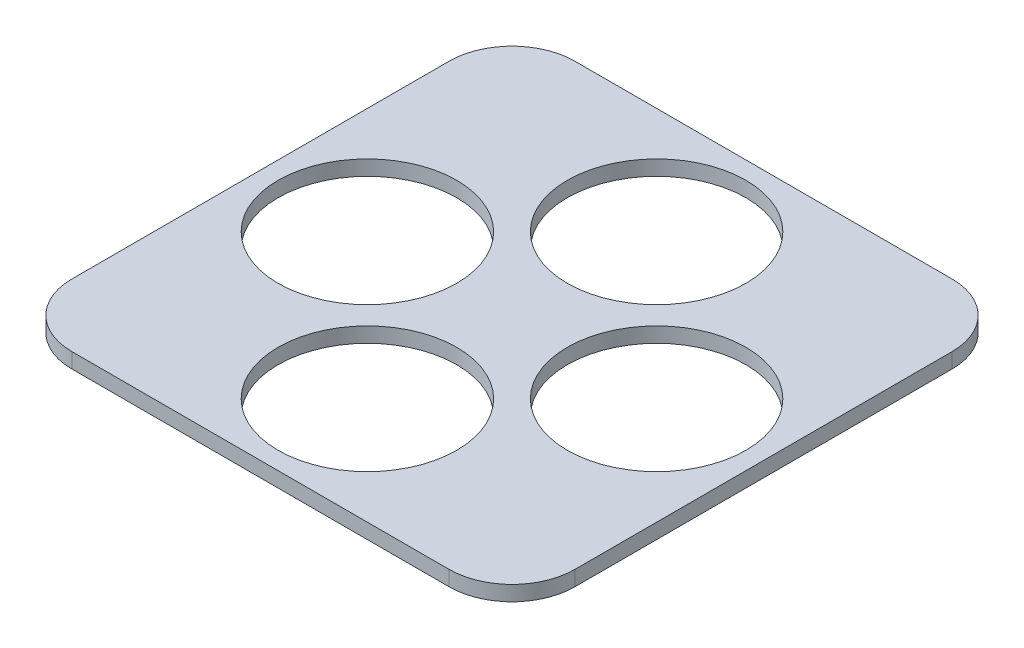
ISO-10303-21;
HEADER;
FILE_DESCRIPTION(('STEP AP214'),'2;1');
FILE_NAME('part.step','',(''),(''),'','','');
FILE_SCHEMA(('AUTOMOTIVE_DESIGN { 1 0 10303 214 1 1 1 1 }'));
ENDSEC;
DATA;
#1=APPLICATION_CONTEXT('core data for automotive mechanical design processes');
#2=APPLICATION_PROTOCOL_DEFINITION('international standard','automotive_design',2000,#1);
#3=PRODUCT_CONTEXT('',#1,'mechanical');
#4=PRODUCT('Part','Part','',(#3));
#5=PRODUCT_RELATED_PRODUCT_CATEGORY('part','',(#4));
#6=PRODUCT_DEFINITION_FORMATION('','',#4);
#7=PRODUCT_DEFINITION_CONTEXT('part definition',#1,'design');
#8=PRODUCT_DEFINITION('design','',#6,#7);
#9=PRODUCT_DEFINITION_SHAPE('','',#8);
#10=(LENGTH_UNIT() NAMED_UNIT(*) SI_UNIT(.MILLI.,.METRE.));
#11=(NAMED_UNIT(*) PLANE_ANGLE_UNIT() SI_UNIT($,.RADIAN.));
#12=(NAMED_UNIT(*) SI_UNIT($,.STERADIAN.) SOLID_ANGLE_UNIT());
#13=UNCERTAINTY_MEASURE_WITH_UNIT(LENGTH_MEASURE(1.E-05),#10,'distance_accuracy_value','');
#14=(GEOMETRIC_REPRESENTATION_CONTEXT(3) GLOBAL_UNCERTAINTY_ASSIGNED_CONTEXT((#13)) GLOBAL_UNIT_ASSIGNED_CONTEXT((#10,
#11,#12)) REPRESENTATION_CONTEXT('',''));
#15=CARTESIAN_POINT('',(0.,0.,0.));
#16=DIRECTION('',(0.,0.,1.));
#17=DIRECTION('',(1.,0.,0.));
#18=AXIS2_PLACEMENT_3D('',#15,#16,#17);
#19=CARTESIAN_POINT('',(15.,1.2,-15.));
#20=DIRECTION('',(0.,1.,0.));
#21=DIRECTION('',(0.,0.,1.));
#22=AXIS2_PLACEMENT_3D('',#19,#20,#21);
#23=PLANE('',#22);
#24=CARTESIAN_POINT('',(0.,1.2,11.5));
#25=DIRECTION('',(0.,1.,0.));
#26=DIRECTION('',(0.,0.,1.));
#27=AXIS2_PLACEMENT_3D('',#24,#25,#26);
#28=CIRCLE('',#27,7.1);
#29=CARTESIAN_POINT('',(0.,1.2,18.6));
#30=VERTEX_POINT('',#29);
#31=EDGE_CURVE('E187',#30,#30,#28,.T.);
#32=ORIENTED_EDGE('',*,*,#31,.F.);
#33=EDGE_LOOP('',(#32));
#34=FACE_BOUND('',#33,.T.);
#35=CARTESIAN_POINT('',(0.,1.2,-11.5));
#36=DIRECTION('',(0.,1.,0.));
#37=DIRECTION('',(0.,0.,1.));
#38=AXIS2_PLACEMENT_3D('',#35,#36,#37);
#39=CIRCLE('',#38,7.1);
#40=CARTESIAN_POINT('',(0.,1.2,-4.4));
#41=VERTEX_POINT('',#40);
#42=EDGE_CURVE('E133',#41,#41,#39,.T.);
#43=ORIENTED_EDGE('',*,*,#42,.F.);
#44=EDGE_LOOP('',(#43));
#45=FACE_BOUND('',#44,.T.);
#46=CARTESIAN_POINT('',(15.,1.2,-15.));
#47=DIRECTION('',(0.,1.,0.));
#48=DIRECTION('',(0.,0.,1.));
#49=AXIS2_PLACEMENT_3D('',#46,#47,#48);
#50=CIRCLE('',#49,5.);
#51=CARTESIAN_POINT('',(20.,1.2,-15.));
#52=VERTEX_POINT('',#51);
#53=CARTESIAN_POINT('',(15.,1.2,-20.));
#54=VERTEX_POINT('',#53);
#55=EDGE_CURVE('E144',#52,#54,#50,.T.);
#56=ORIENTED_EDGE('',*,*,#55,.T.);
#57=DIRECTION('',(-1.,0.,0.));
#58=VECTOR('',#57,1.);
#59=CARTESIAN_POINT('',(-15.,1.2,-20.));
#60=LINE('',#59,#58);
#61=CARTESIAN_POINT('',(-15.,1.2,-20.));
#62=VERTEX_POINT('',#61);
#63=EDGE_CURVE('E92',#54,#62,#60,.T.);
#64=ORIENTED_EDGE('',*,*,#63,.T.);
#65=CARTESIAN_POINT('',(-15.,1.2,-15.));
#66=DIRECTION('',(0.,1.,0.));
#67=DIRECTION('',(0.,0.,-1.));
#68=AXIS2_PLACEMENT_3D('',#65,#66,#67);
#69=CIRCLE('',#68,5.);
#70=CARTESIAN_POINT('',(-20.,1.2,-15.));
#71=VERTEX_POINT('',#70);
#72=EDGE_CURVE('E159',#62,#71,#69,.T.);
#73=ORIENTED_EDGE('',*,*,#72,.T.);
#74=DIRECTION('',(0.,0.,1.));
#75=VECTOR('',#74,1.);
#76=CARTESIAN_POINT('',(-20.,1.2,15.));
#77=LINE('',#76,#75);
#78=CARTESIAN_POINT('',(-20.,1.2,15.));
#79=VERTEX_POINT('',#78);
#80=EDGE_CURVE('E172',#71,#79,#77,.T.);
#81=ORIENTED_EDGE('',*,*,#80,.T.);
#82=CARTESIAN_POINT('',(-15.,1.2,15.));
#83=DIRECTION('',(0.,1.,0.));
#84=DIRECTION('',(0.,0.,-1.));
#85=AXIS2_PLACEMENT_3D('',#82,#83,#84);
#86=CIRCLE('',#85,5.);
#87=CARTESIAN_POINT('',(-15.,1.2,20.));
#88=VERTEX_POINT('',#87);
#89=EDGE_CURVE('E111',#79,#88,#86,.T.);
#90=ORIENTED_EDGE('',*,*,#89,.T.);
#91=DIRECTION('',(1.,0.,0.));
#92=VECTOR('',#91,1.);
#93=CARTESIAN_POINT('',(-15.,1.2,20.));
#94=LINE('',#93,#92);
#95=CARTESIAN_POINT('',(15.,1.2,20.));
#96=VERTEX_POINT('',#95);
#97=EDGE_CURVE('E105',#88,#96,#94,.T.);
#98=ORIENTED_EDGE('',*,*,#97,.T.);
#99=CARTESIAN_POINT('',(15.,1.2,15.));
#100=DIRECTION('',(0.,1.,0.));
#101=DIRECTION('',(0.,0.,-1.));
#102=AXIS2_PLACEMENT_3D('',#99,#100,#101);
#103=CIRCLE('',#102,5.);
#104=CARTESIAN_POINT('',(20.,1.2,15.));
#105=VERTEX_POINT('',#104);
#106=EDGE_CURVE('E109',#96,#105,#103,.T.);
#107=ORIENTED_EDGE('',*,*,#106,.T.);
#108=DIRECTION('',(0.,0.,-1.));
#109=VECTOR('',#108,1.);
#110=CARTESIAN_POINT('',(20.,1.2,15.));
#111=LINE('',#110,#109);
#112=EDGE_CURVE('E49',#105,#52,#111,.T.);
#113=ORIENTED_EDGE('',*,*,#112,.T.);
#114=EDGE_LOOP('',(#56,#64,#73,#81,#90,#98,#107,#113));
#115=FACE_BOUND('',#114,.T.);
#116=CARTESIAN_POINT('',(11.5,1.2,0.));
#117=DIRECTION('',(0.,1.,0.));
#118=DIRECTION('',(0.,0.,1.));
#119=AXIS2_PLACEMENT_3D('',#116,#117,#118);
#120=CIRCLE('',#119,7.1);
#121=CARTESIAN_POINT('',(11.5,1.2,7.1));
#122=VERTEX_POINT('',#121);
#123=EDGE_CURVE('E181',#122,#122,#120,.T.);
#124=ORIENTED_EDGE('',*,*,#123,.F.);
#125=EDGE_LOOP('',(#124));
#126=FACE_BOUND('',#125,.T.);
#127=CARTESIAN_POINT('',(-11.5,1.2,0.));
#128=DIRECTION('',(0.,1.,0.));
#129=DIRECTION('',(0.,0.,1.));
#130=AXIS2_PLACEMENT_3D('',#127,#128,#129);
#131=CIRCLE('',#130,7.1);
#132=CARTESIAN_POINT('',(-11.5,1.2,7.1));
#133=VERTEX_POINT('',#132);
#134=EDGE_CURVE('E193',#133,#133,#131,.T.);
#135=ORIENTED_EDGE('',*,*,#134,.F.);
#136=EDGE_LOOP('',(#135));
#137=FACE_BOUND('',#136,.T.);
#138=ADVANCED_FACE('F32',(#34,#45,#115,#126,#137),#23,.T.);
#139=CARTESIAN_POINT('',(15.,0.,-15.));
#140=DIRECTION('',(0.,1.,0.));
#141=DIRECTION('',(0.,0.,1.));
#142=AXIS2_PLACEMENT_3D('',#139,#140,#141);
#143=PLANE('',#142);
#144=CARTESIAN_POINT('',(15.,0.,-15.));
#145=DIRECTION('',(0.,1.,0.));
#146=DIRECTION('',(0.,0.,1.));
#147=AXIS2_PLACEMENT_3D('',#144,#145,#146);
#148=CIRCLE('',#147,5.);
#149=CARTESIAN_POINT('',(20.,0.,-15.));
#150=VERTEX_POINT('',#149);
#151=CARTESIAN_POINT('',(15.,0.,-20.));
#152=VERTEX_POINT('',#151);
#153=EDGE_CURVE('E129',#150,#152,#148,.T.);
#154=ORIENTED_EDGE('',*,*,#153,.F.);
#155=DIRECTION('',(0.,0.,-1.));
#156=VECTOR('',#155,1.);
#157=CARTESIAN_POINT('',(20.,0.,15.));
#158=LINE('',#157,#156);
#159=CARTESIAN_POINT('',(20.,0.,15.));
#160=VERTEX_POINT('',#159);
#161=EDGE_CURVE('E84',#160,#150,#158,.T.);
#162=ORIENTED_EDGE('',*,*,#161,.F.);
#163=CARTESIAN_POINT('',(15.,0.,15.));
#164=DIRECTION('',(0.,1.,0.));
#165=DIRECTION('',(0.,0.,-1.));
#166=AXIS2_PLACEMENT_3D('',#163,#164,#165);
#167=CIRCLE('',#166,5.);
#168=CARTESIAN_POINT('',(15.,0.,20.));
#169=VERTEX_POINT('',#168);
#170=EDGE_CURVE('E78',#169,#160,#167,.T.);
#171=ORIENTED_EDGE('',*,*,#170,.F.);
#172=DIRECTION('',(1.,0.,0.));
#173=VECTOR('',#172,1.);
#174=CARTESIAN_POINT('',(-15.,0.,20.));
#175=LINE('',#174,#173);
#176=CARTESIAN_POINT('',(-15.,0.,20.));
#177=VERTEX_POINT('',#176);
#178=EDGE_CURVE('E119',#177,#169,#175,.T.);
#179=ORIENTED_EDGE('',*,*,#178,.F.);
#180=CARTESIAN_POINT('',(-15.,0.,15.));
#181=DIRECTION('',(0.,1.,0.));
#182=DIRECTION('',(0.,0.,-1.));
#183=AXIS2_PLACEMENT_3D('',#180,#181,#182);
#184=CIRCLE('',#183,5.);
#185=CARTESIAN_POINT('',(-20.,0.,15.));
#186=VERTEX_POINT('',#185);
#187=EDGE_CURVE('E139',#186,#177,#184,.T.);
#188=ORIENTED_EDGE('',*,*,#187,.F.);
#189=DIRECTION('',(0.,0.,1.));
#190=VECTOR('',#189,1.);
#191=CARTESIAN_POINT('',(-20.,0.,15.));
#192=LINE('',#191,#190);
#193=CARTESIAN_POINT('',(-20.,0.,-15.));
#194=VERTEX_POINT('',#193);
#195=EDGE_CURVE('E137',#194,#186,#192,.T.);
#196=ORIENTED_EDGE('',*,*,#195,.F.);
#197=CARTESIAN_POINT('',(-15.,0.,-15.));
#198=DIRECTION('',(0.,1.,0.));
#199=DIRECTION('',(0.,0.,-1.));
#200=AXIS2_PLACEMENT_3D('',#197,#198,#199);
#201=CIRCLE('',#200,5.);
#202=CARTESIAN_POINT('',(-15.,0.,-20.));
#203=VERTEX_POINT('',#202);
#204=EDGE_CURVE('E135',#203,#194,#201,.T.);
#205=ORIENTED_EDGE('',*,*,#204,.F.);
#206=DIRECTION('',(-1.,0.,0.));
#207=VECTOR('',#206,1.);
#208=CARTESIAN_POINT('',(-15.,0.,-20.));
#209=LINE('',#208,#207);
#210=EDGE_CURVE('E132',#152,#203,#209,.T.);
#211=ORIENTED_EDGE('',*,*,#210,.F.);
#212=EDGE_LOOP('',(#154,#162,#171,#179,#188,#196,#205,#211));
#213=FACE_BOUND('',#212,.T.);
#214=CARTESIAN_POINT('',(0.,0.,-11.5));
#215=DIRECTION('',(0.,1.,0.));
#216=DIRECTION('',(0.,0.,1.));
#217=AXIS2_PLACEMENT_3D('',#214,#215,#216);
#218=CIRCLE('',#217,7.1);
#219=CARTESIAN_POINT('',(0.,0.,-4.4));
#220=VERTEX_POINT('',#219);
#221=EDGE_CURVE('E178',#220,#220,#218,.T.);
#222=ORIENTED_EDGE('',*,*,#221,.T.);
#223=EDGE_LOOP('',(#222));
#224=FACE_BOUND('',#223,.T.);
#225=CARTESIAN_POINT('',(11.5,0.,0.));
#226=DIRECTION('',(0.,1.,0.));
#227=DIRECTION('',(0.,0.,1.));
#228=AXIS2_PLACEMENT_3D('',#225,#226,#227);
#229=CIRCLE('',#228,7.1);
#230=CARTESIAN_POINT('',(11.5,0.,7.1));
#231=VERTEX_POINT('',#230);
#232=EDGE_CURVE('E184',#231,#231,#229,.T.);
#233=ORIENTED_EDGE('',*,*,#232,.T.);
#234=EDGE_LOOP('',(#233));
#235=FACE_BOUND('',#234,.T.);
#236=CARTESIAN_POINT('',(0.,0.,11.5));
#237=DIRECTION('',(0.,1.,0.));
#238=DIRECTION('',(0.,0.,1.));
#239=AXIS2_PLACEMENT_3D('',#236,#237,#238);
#240=CIRCLE('',#239,7.1);
#241=CARTESIAN_POINT('',(0.,0.,18.6));
#242=VERTEX_POINT('',#241);
#243=EDGE_CURVE('E190',#242,#242,#240,.T.);
#244=ORIENTED_EDGE('',*,*,#243,.T.);
#245=EDGE_LOOP('',(#244));
#246=FACE_BOUND('',#245,.T.);
#247=CARTESIAN_POINT('',(-11.5,0.,0.));
#248=DIRECTION('',(0.,1.,0.));
#249=DIRECTION('',(0.,0.,1.));
#250=AXIS2_PLACEMENT_3D('',#247,#248,#249);
#251=CIRCLE('',#250,7.1);
#252=CARTESIAN_POINT('',(-11.5,0.,7.1));
#253=VERTEX_POINT('',#252);
#254=EDGE_CURVE('E196',#253,#253,#251,.T.);
#255=ORIENTED_EDGE('',*,*,#254,.T.);
#256=EDGE_LOOP('',(#255));
#257=FACE_BOUND('',#256,.T.);
#258=ADVANCED_FACE('F163',(#213,#224,#235,#246,#257),#143,.F.);
#259=CARTESIAN_POINT('',(15.,1.2,-15.));
#260=DIRECTION('',(0.,-1.,0.));
#261=DIRECTION('',(0.,0.,-1.));
#262=AXIS2_PLACEMENT_3D('',#259,#260,#261);
#263=CYLINDRICAL_SURFACE('',#262,5.);
#264=ORIENTED_EDGE('',*,*,#153,.T.);
#265=DIRECTION('',(0.,-1.,0.));
#266=VECTOR('',#265,1.);
#267=CARTESIAN_POINT('',(15.,1.2,-20.));
#268=LINE('',#267,#266);
#269=EDGE_CURVE('E11',#54,#152,#268,.T.);
#270=ORIENTED_EDGE('',*,*,#269,.F.);
#271=ORIENTED_EDGE('',*,*,#55,.F.);
#272=DIRECTION('',(0.,-1.,0.));
#273=VECTOR('',#272,1.);
#274=CARTESIAN_POINT('',(20.,1.2,-15.));
#275=LINE('',#274,#273);
#276=EDGE_CURVE('E125',#52,#150,#275,.T.);
#277=ORIENTED_EDGE('',*,*,#276,.T.);
#278=EDGE_LOOP('',(#264,#270,#271,#277));
#279=FACE_BOUND('',#278,.T.);
#280=ADVANCED_FACE('F34',(#279),#263,.T.);
#281=CARTESIAN_POINT('',(-15.,1.2,-20.));
#282=DIRECTION('',(0.,0.,1.));
#283=DIRECTION('',(1.,0.,0.));
#284=AXIS2_PLACEMENT_3D('',#281,#282,#283);
#285=PLANE('',#284);
#286=ORIENTED_EDGE('',*,*,#210,.T.);
#287=DIRECTION('',(0.,-1.,0.));
#288=VECTOR('',#287,1.);
#289=CARTESIAN_POINT('',(-15.,1.2,-20.));
#290=LINE('',#289,#288);
#291=EDGE_CURVE('E41',#62,#203,#290,.T.);
#292=ORIENTED_EDGE('',*,*,#291,.F.);
#293=ORIENTED_EDGE('',*,*,#63,.F.);
#294=ORIENTED_EDGE('',*,*,#269,.T.);
#295=EDGE_LOOP('',(#286,#292,#293,#294));
#296=FACE_BOUND('',#295,.T.);
#297=ADVANCED_FACE('F230',(#296),#285,.F.);
#298=CARTESIAN_POINT('',(-15.,1.2,-15.));
#299=DIRECTION('',(0.,-1.,0.));
#300=DIRECTION('',(0.,0.,-1.));
#301=AXIS2_PLACEMENT_3D('',#298,#299,#300);
#302=CYLINDRICAL_SURFACE('',#301,5.);
#303=ORIENTED_EDGE('',*,*,#204,.T.);
#304=DIRECTION('',(0.,-1.,0.));
#305=VECTOR('',#304,1.);
#306=CARTESIAN_POINT('',(-20.,1.2,-15.));
#307=LINE('',#306,#305);
#308=EDGE_CURVE('E151',#71,#194,#307,.T.);
#309=ORIENTED_EDGE('',*,*,#308,.F.);
#310=ORIENTED_EDGE('',*,*,#72,.F.);
#311=ORIENTED_EDGE('',*,*,#291,.T.);
#312=EDGE_LOOP('',(#303,#309,#310,#311));
#313=FACE_BOUND('',#312,.T.);
#314=ADVANCED_FACE('F157',(#313),#302,.T.);
#315=CARTESIAN_POINT('',(-20.,1.2,15.));
#316=DIRECTION('',(1.,0.,0.));
#317=DIRECTION('',(0.,0.,-1.));
#318=AXIS2_PLACEMENT_3D('',#315,#316,#317);
#319=PLANE('',#318);
#320=ORIENTED_EDGE('',*,*,#195,.T.);
#321=DIRECTION('',(0.,-1.,0.));
#322=VECTOR('',#321,1.);
#323=CARTESIAN_POINT('',(-20.,1.2,15.));
#324=LINE('',#323,#322);
#325=EDGE_CURVE('E148',#79,#186,#324,.T.);
#326=ORIENTED_EDGE('',*,*,#325,.F.);
#327=ORIENTED_EDGE('',*,*,#80,.F.);
#328=ORIENTED_EDGE('',*,*,#308,.T.);
#329=EDGE_LOOP('',(#320,#326,#327,#328));
#330=FACE_BOUND('',#329,.T.);
#331=ADVANCED_FACE('F168',(#330),#319,.F.);
#332=CARTESIAN_POINT('',(-15.,1.2,15.));
#333=DIRECTION('',(0.,-1.,0.));
#334=DIRECTION('',(0.,0.,-1.));
#335=AXIS2_PLACEMENT_3D('',#332,#333,#334);
#336=CYLINDRICAL_SURFACE('',#335,5.);
#337=ORIENTED_EDGE('',*,*,#187,.T.);
#338=DIRECTION('',(0.,-1.,0.));
#339=VECTOR('',#338,1.);
#340=CARTESIAN_POINT('',(-15.,1.2,20.));
#341=LINE('',#340,#339);
#342=EDGE_CURVE('E120',#88,#177,#341,.T.);
#343=ORIENTED_EDGE('',*,*,#342,.F.);
#344=ORIENTED_EDGE('',*,*,#89,.F.);
#345=ORIENTED_EDGE('',*,*,#325,.T.);
#346=EDGE_LOOP('',(#337,#343,#344,#345));
#347=FACE_BOUND('',#346,.T.);
#348=ADVANCED_FACE('F171',(#347),#336,.T.);
#349=CARTESIAN_POINT('',(-15.,1.2,20.));
#350=DIRECTION('',(0.,0.,-1.));
#351=DIRECTION('',(-1.,0.,0.));
#352=AXIS2_PLACEMENT_3D('',#349,#350,#351);
#353=PLANE('',#352);
#354=ORIENTED_EDGE('',*,*,#178,.T.);
#355=DIRECTION('',(0.,-1.,0.));
#356=VECTOR('',#355,1.);
#357=CARTESIAN_POINT('',(15.,1.2,20.));
#358=LINE('',#357,#356);
#359=EDGE_CURVE('E116',#96,#169,#358,.T.);
#360=ORIENTED_EDGE('',*,*,#359,.F.);
#361=ORIENTED_EDGE('',*,*,#97,.F.);
#362=ORIENTED_EDGE('',*,*,#342,.T.);
#363=EDGE_LOOP('',(#354,#360,#361,#362));
#364=FACE_BOUND('',#363,.T.);
#365=ADVANCED_FACE('F117',(#364),#353,.F.);
#366=CARTESIAN_POINT('',(15.,1.2,15.));
#367=DIRECTION('',(0.,-1.,0.));
#368=DIRECTION('',(0.,0.,-1.));
#369=AXIS2_PLACEMENT_3D('',#366,#367,#368);
#370=CYLINDRICAL_SURFACE('',#369,5.);
#371=ORIENTED_EDGE('',*,*,#170,.T.);
#372=DIRECTION('',(0.,-1.,0.));
#373=VECTOR('',#372,1.);
#374=CARTESIAN_POINT('',(20.,1.2,15.));
#375=LINE('',#374,#373);
#376=EDGE_CURVE('E121',#105,#160,#375,.T.);
#377=ORIENTED_EDGE('',*,*,#376,.F.);
#378=ORIENTED_EDGE('',*,*,#106,.F.);
#379=ORIENTED_EDGE('',*,*,#359,.T.);
#380=EDGE_LOOP('',(#371,#377,#378,#379));
#381=FACE_BOUND('',#380,.T.);
#382=ADVANCED_FACE('F123',(#381),#370,.T.);
#383=CARTESIAN_POINT('',(20.,1.2,15.));
#384=DIRECTION('',(-1.,0.,0.));
#385=DIRECTION('',(0.,0.,1.));
#386=AXIS2_PLACEMENT_3D('',#383,#384,#385);
#387=PLANE('',#386);
#388=ORIENTED_EDGE('',*,*,#161,.T.);
#389=ORIENTED_EDGE('',*,*,#276,.F.);
#390=ORIENTED_EDGE('',*,*,#112,.F.);
#391=ORIENTED_EDGE('',*,*,#376,.T.);
#392=EDGE_LOOP('',(#388,#389,#390,#391));
#393=FACE_BOUND('',#392,.T.);
#394=ADVANCED_FACE('F218',(#393),#387,.F.);
#395=CARTESIAN_POINT('',(0.,1.2,-11.5));
#396=DIRECTION('',(0.,-1.,0.));
#397=DIRECTION('',(0.,0.,-1.));
#398=AXIS2_PLACEMENT_3D('',#395,#396,#397);
#399=CYLINDRICAL_SURFACE('',#398,7.1);
#400=ORIENTED_EDGE('',*,*,#42,.T.);
#401=EDGE_LOOP('',(#400));
#402=FACE_BOUND('',#401,.T.);
#403=ORIENTED_EDGE('',*,*,#221,.F.);
#404=EDGE_LOOP('',(#403));
#405=FACE_BOUND('',#404,.T.);
#406=ADVANCED_FACE('F215',(#402,#405),#399,.F.);
#407=CARTESIAN_POINT('',(11.5,1.2,0.));
#408=DIRECTION('',(0.,-1.,0.));
#409=DIRECTION('',(0.,0.,-1.));
#410=AXIS2_PLACEMENT_3D('',#407,#408,#409);
#411=CYLINDRICAL_SURFACE('',#410,7.1);
#412=ORIENTED_EDGE('',*,*,#123,.T.);
#413=EDGE_LOOP('',(#412));
#414=FACE_BOUND('',#413,.T.);
#415=ORIENTED_EDGE('',*,*,#232,.F.);
#416=EDGE_LOOP('',(#415));
#417=FACE_BOUND('',#416,.T.);
#418=ADVANCED_FACE('F294',(#414,#417),#411,.F.);
#419=CARTESIAN_POINT('',(0.,1.2,11.5));
#420=DIRECTION('',(0.,-1.,0.));
#421=DIRECTION('',(0.,0.,-1.));
#422=AXIS2_PLACEMENT_3D('',#419,#420,#421);
#423=CYLINDRICAL_SURFACE('',#422,7.1);
#424=ORIENTED_EDGE('',*,*,#31,.T.);
#425=EDGE_LOOP('',(#424));
#426=FACE_BOUND('',#425,.T.);
#427=ORIENTED_EDGE('',*,*,#243,.F.);
#428=EDGE_LOOP('',(#427));
#429=FACE_BOUND('',#428,.T.);
#430=ADVANCED_FACE('F302',(#426,#429),#423,.F.);
#431=CARTESIAN_POINT('',(-11.5,1.2,0.));
#432=DIRECTION('',(0.,-1.,0.));
#433=DIRECTION('',(0.,0.,-1.));
#434=AXIS2_PLACEMENT_3D('',#431,#432,#433);
#435=CYLINDRICAL_SURFACE('',#434,7.1);
#436=ORIENTED_EDGE('',*,*,#134,.T.);
#437=EDGE_LOOP('',(#436));
#438=FACE_BOUND('',#437,.T.);
#439=ORIENTED_EDGE('',*,*,#254,.F.);
#440=EDGE_LOOP('',(#439));
#441=FACE_BOUND('',#440,.T.);
#442=ADVANCED_FACE('F202',(#438,#441),#435,.F.);
#443=CLOSED_SHELL('',(#138,#258,#280,#297,#314,#331,#348,#365,#382,#394,#406,#418,#430,#442));
#444=MANIFOLD_SOLID_BREP('B2',#443);
#445=ADVANCED_BREP_SHAPE_REPRESENTATION('',(#18,#444),#14);
#446=SHAPE_DEFINITION_REPRESENTATION(#9,#445);
ENDSEC;
END-ISO-10303-21;
